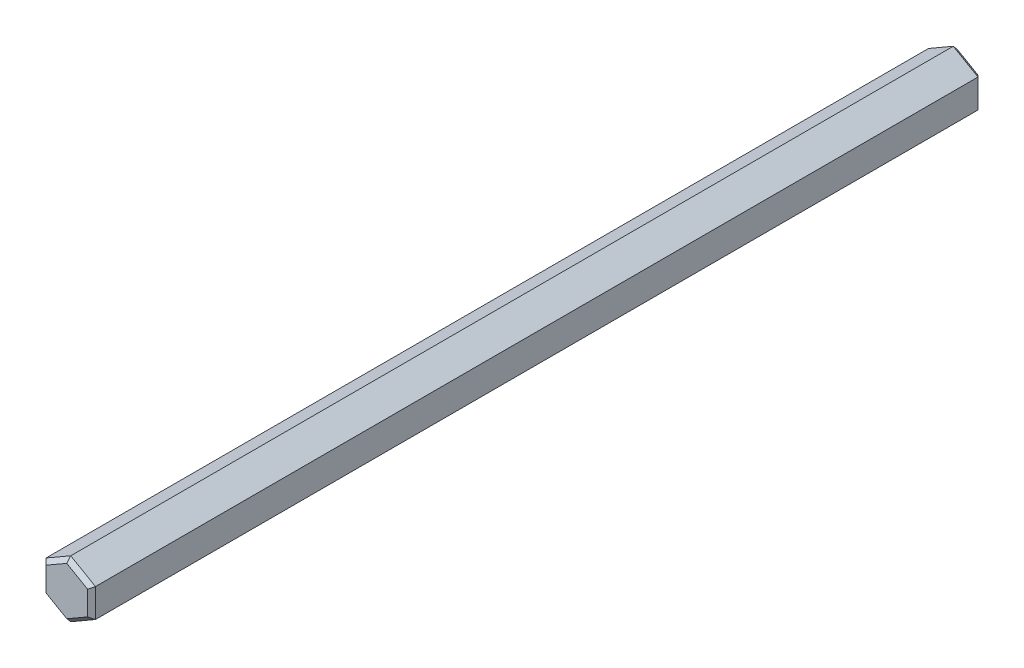
ISO-10303-21;
HEADER;
FILE_DESCRIPTION(('STEP AP214'),'2;1');
FILE_NAME('part.step','',(''),(''),'','','');
FILE_SCHEMA(('AUTOMOTIVE_DESIGN { 1 0 10303 214 1 1 1 1 }'));
ENDSEC;
DATA;
#1=APPLICATION_CONTEXT('core data for automotive mechanical design processes');
#2=APPLICATION_PROTOCOL_DEFINITION('international standard','automotive_design',2000,#1);
#3=PRODUCT_CONTEXT('',#1,'mechanical');
#4=PRODUCT('Part','Part','',(#3));
#5=PRODUCT_RELATED_PRODUCT_CATEGORY('part','',(#4));
#6=PRODUCT_DEFINITION_FORMATION('','',#4);
#7=PRODUCT_DEFINITION_CONTEXT('part definition',#1,'design');
#8=PRODUCT_DEFINITION('design','',#6,#7);
#9=PRODUCT_DEFINITION_SHAPE('','',#8);
#10=(LENGTH_UNIT() NAMED_UNIT(*) SI_UNIT(.MILLI.,.METRE.));
#11=(NAMED_UNIT(*) PLANE_ANGLE_UNIT() SI_UNIT($,.RADIAN.));
#12=(NAMED_UNIT(*) SI_UNIT($,.STERADIAN.) SOLID_ANGLE_UNIT());
#13=UNCERTAINTY_MEASURE_WITH_UNIT(LENGTH_MEASURE(1.E-05),#10,'distance_accuracy_value','');
#14=(GEOMETRIC_REPRESENTATION_CONTEXT(3) GLOBAL_UNCERTAINTY_ASSIGNED_CONTEXT((#13)) GLOBAL_UNIT_ASSIGNED_CONTEXT((#10,
#11,#12)) REPRESENTATION_CONTEXT('',''));
#15=CARTESIAN_POINT('',(0.,0.,0.));
#16=DIRECTION('',(0.,0.,1.));
#17=DIRECTION('',(1.,0.,0.));
#18=AXIS2_PLACEMENT_3D('',#15,#16,#17);
#19=CARTESIAN_POINT('',(2.5,-1.44337567297407,45.));
#20=DIRECTION('',(0.5,-0.866025403784439,0.));
#21=DIRECTION('',(0.866025403784439,0.5,0.));
#22=AXIS2_PLACEMENT_3D('',#19,#20,#21);
#23=PLANE('',#22);
#24=DIRECTION('',(0.,0.,-1.));
#25=VECTOR('',#24,1.);
#26=CARTESIAN_POINT('',(2.5,-1.44337567297407,45.));
#27=LINE('',#26,#25);
#28=CARTESIAN_POINT('',(2.5,-1.44337567297407,44.6));
#29=VERTEX_POINT('',#28);
#30=CARTESIAN_POINT('',(2.5,-1.44337567297407,-44.6));
#31=VERTEX_POINT('',#30);
#32=EDGE_CURVE('E150',#29,#31,#27,.T.);
#33=ORIENTED_EDGE('',*,*,#32,.F.);
#34=DIRECTION('',(-0.866025403784439,-0.5,0.));
#35=VECTOR('',#34,1.);
#36=CARTESIAN_POINT('',(0.,-2.88675134594813,44.6));
#37=LINE('',#36,#35);
#38=CARTESIAN_POINT('',(0.,-2.88675134594813,44.6));
#39=VERTEX_POINT('',#38);
#40=EDGE_CURVE('E182',#29,#39,#37,.T.);
#41=ORIENTED_EDGE('',*,*,#40,.T.);
#42=DIRECTION('',(0.,0.,-1.));
#43=VECTOR('',#42,1.);
#44=CARTESIAN_POINT('',(0.,-2.88675134594813,45.));
#45=LINE('',#44,#43);
#46=CARTESIAN_POINT('',(0.,-2.88675134594813,-44.6));
#47=VERTEX_POINT('',#46);
#48=EDGE_CURVE('E215',#39,#47,#45,.T.);
#49=ORIENTED_EDGE('',*,*,#48,.T.);
#50=DIRECTION('',(0.866025403784439,0.5,0.));
#51=VECTOR('',#50,1.);
#52=CARTESIAN_POINT('',(2.5,-1.44337567297407,-44.6));
#53=LINE('',#52,#51);
#54=EDGE_CURVE('E138',#47,#31,#53,.T.);
#55=ORIENTED_EDGE('',*,*,#54,.T.);
#56=EDGE_LOOP('',(#33,#41,#49,#55));
#57=FACE_BOUND('',#56,.T.);
#58=ADVANCED_FACE('F33',(#57),#23,.T.);
#59=CARTESIAN_POINT('',(2.5,1.44337567297406,45.));
#60=DIRECTION('',(1.,0.,0.));
#61=DIRECTION('',(0.,0.,-1.));
#62=AXIS2_PLACEMENT_3D('',#59,#60,#61);
#63=PLANE('',#62);
#64=DIRECTION('',(0.,0.,-1.));
#65=VECTOR('',#64,1.);
#66=CARTESIAN_POINT('',(2.5,1.44337567297406,45.));
#67=LINE('',#66,#65);
#68=CARTESIAN_POINT('',(2.5,1.44337567297406,44.6));
#69=VERTEX_POINT('',#68);
#70=CARTESIAN_POINT('',(2.5,1.44337567297406,-44.6));
#71=VERTEX_POINT('',#70);
#72=EDGE_CURVE('E131',#69,#71,#67,.T.);
#73=ORIENTED_EDGE('',*,*,#72,.F.);
#74=DIRECTION('',(0.,-1.,0.));
#75=VECTOR('',#74,1.);
#76=CARTESIAN_POINT('',(2.5,-1.44337567297407,44.6));
#77=LINE('',#76,#75);
#78=EDGE_CURVE('E146',#69,#29,#77,.T.);
#79=ORIENTED_EDGE('',*,*,#78,.T.);
#80=ORIENTED_EDGE('',*,*,#32,.T.);
#81=DIRECTION('',(0.,1.,0.));
#82=VECTOR('',#81,1.);
#83=CARTESIAN_POINT('',(2.5,1.44337567297406,-44.6));
#84=LINE('',#83,#82);
#85=EDGE_CURVE('E149',#31,#71,#84,.T.);
#86=ORIENTED_EDGE('',*,*,#85,.T.);
#87=EDGE_LOOP('',(#73,#79,#80,#86));
#88=FACE_BOUND('',#87,.T.);
#89=ADVANCED_FACE('F143',(#88),#63,.T.);
#90=CARTESIAN_POINT('',(0.,2.88675134594813,45.));
#91=DIRECTION('',(0.5,0.866025403784439,0.));
#92=DIRECTION('',(-0.866025403784439,0.5,0.));
#93=AXIS2_PLACEMENT_3D('',#90,#91,#92);
#94=PLANE('',#93);
#95=DIRECTION('',(0.,0.,-1.));
#96=VECTOR('',#95,1.);
#97=CARTESIAN_POINT('',(0.,2.88675134594813,45.));
#98=LINE('',#97,#96);
#99=CARTESIAN_POINT('',(0.,2.88675134594813,44.6));
#100=VERTEX_POINT('',#99);
#101=CARTESIAN_POINT('',(0.,2.88675134594813,-44.6));
#102=VERTEX_POINT('',#101);
#103=EDGE_CURVE('E133',#100,#102,#98,.T.);
#104=ORIENTED_EDGE('',*,*,#103,.F.);
#105=DIRECTION('',(0.866025403784439,-0.5,0.));
#106=VECTOR('',#105,1.);
#107=CARTESIAN_POINT('',(2.5,1.44337567297406,44.6));
#108=LINE('',#107,#106);
#109=EDGE_CURVE('E127',#100,#69,#108,.T.);
#110=ORIENTED_EDGE('',*,*,#109,.T.);
#111=ORIENTED_EDGE('',*,*,#72,.T.);
#112=DIRECTION('',(-0.866025403784439,0.5,0.));
#113=VECTOR('',#112,1.);
#114=CARTESIAN_POINT('',(0.,2.88675134594813,-44.6));
#115=LINE('',#114,#113);
#116=EDGE_CURVE('E139',#71,#102,#115,.T.);
#117=ORIENTED_EDGE('',*,*,#116,.T.);
#118=EDGE_LOOP('',(#104,#110,#111,#117));
#119=FACE_BOUND('',#118,.T.);
#120=ADVANCED_FACE('F129',(#119),#94,.T.);
#121=CARTESIAN_POINT('',(-2.5,1.44337567297407,45.));
#122=DIRECTION('',(-0.5,0.866025403784439,0.));
#123=DIRECTION('',(-0.866025403784439,-0.5,0.));
#124=AXIS2_PLACEMENT_3D('',#121,#122,#123);
#125=PLANE('',#124);
#126=DIRECTION('',(0.,0.,-1.));
#127=VECTOR('',#126,1.);
#128=CARTESIAN_POINT('',(-2.5,1.44337567297407,45.));
#129=LINE('',#128,#127);
#130=CARTESIAN_POINT('',(-2.5,1.44337567297407,44.6));
#131=VERTEX_POINT('',#130);
#132=CARTESIAN_POINT('',(-2.5,1.44337567297407,-44.6));
#133=VERTEX_POINT('',#132);
#134=EDGE_CURVE('E249',#131,#133,#129,.T.);
#135=ORIENTED_EDGE('',*,*,#134,.F.);
#136=DIRECTION('',(0.866025403784439,0.5,0.));
#137=VECTOR('',#136,1.);
#138=CARTESIAN_POINT('',(0.,2.88675134594813,44.6));
#139=LINE('',#138,#137);
#140=EDGE_CURVE('E186',#131,#100,#139,.T.);
#141=ORIENTED_EDGE('',*,*,#140,.T.);
#142=ORIENTED_EDGE('',*,*,#103,.T.);
#143=DIRECTION('',(-0.866025403784439,-0.5,0.));
#144=VECTOR('',#143,1.);
#145=CARTESIAN_POINT('',(-2.5,1.44337567297407,-44.6));
#146=LINE('',#145,#144);
#147=EDGE_CURVE('E184',#102,#133,#146,.T.);
#148=ORIENTED_EDGE('',*,*,#147,.T.);
#149=EDGE_LOOP('',(#135,#141,#142,#148));
#150=FACE_BOUND('',#149,.T.);
#151=ADVANCED_FACE('F266',(#150),#125,.T.);
#152=CARTESIAN_POINT('',(-2.5,-1.44337567297406,45.));
#153=DIRECTION('',(-1.,0.,0.));
#154=DIRECTION('',(0.,0.,1.));
#155=AXIS2_PLACEMENT_3D('',#152,#153,#154);
#156=PLANE('',#155);
#157=DIRECTION('',(0.,0.,-1.));
#158=VECTOR('',#157,1.);
#159=CARTESIAN_POINT('',(-2.5,-1.44337567297406,45.));
#160=LINE('',#159,#158);
#161=CARTESIAN_POINT('',(-2.5,-1.44337567297406,44.6));
#162=VERTEX_POINT('',#161);
#163=CARTESIAN_POINT('',(-2.5,-1.44337567297406,-44.6));
#164=VERTEX_POINT('',#163);
#165=EDGE_CURVE('E247',#162,#164,#160,.T.);
#166=ORIENTED_EDGE('',*,*,#165,.F.);
#167=DIRECTION('',(0.,1.,0.));
#168=VECTOR('',#167,1.);
#169=CARTESIAN_POINT('',(-2.5,1.44337567297407,44.6));
#170=LINE('',#169,#168);
#171=EDGE_CURVE('E194',#162,#131,#170,.T.);
#172=ORIENTED_EDGE('',*,*,#171,.T.);
#173=ORIENTED_EDGE('',*,*,#134,.T.);
#174=DIRECTION('',(0.,-1.,0.));
#175=VECTOR('',#174,1.);
#176=CARTESIAN_POINT('',(-2.5,-1.44337567297406,-44.6));
#177=LINE('',#176,#175);
#178=EDGE_CURVE('E192',#133,#164,#177,.T.);
#179=ORIENTED_EDGE('',*,*,#178,.T.);
#180=EDGE_LOOP('',(#166,#172,#173,#179));
#181=FACE_BOUND('',#180,.T.);
#182=ADVANCED_FACE('F303',(#181),#156,.T.);
#183=CARTESIAN_POINT('',(0.,-2.88675134594813,45.));
#184=DIRECTION('',(-0.5,-0.866025403784439,0.));
#185=DIRECTION('',(0.866025403784439,-0.5,0.));
#186=AXIS2_PLACEMENT_3D('',#183,#184,#185);
#187=PLANE('',#186);
#188=ORIENTED_EDGE('',*,*,#48,.F.);
#189=DIRECTION('',(-0.866025403784439,0.5,0.));
#190=VECTOR('',#189,1.);
#191=CARTESIAN_POINT('',(-2.5,-1.44337567297406,44.6));
#192=LINE('',#191,#190);
#193=EDGE_CURVE('E190',#39,#162,#192,.T.);
#194=ORIENTED_EDGE('',*,*,#193,.T.);
#195=ORIENTED_EDGE('',*,*,#165,.T.);
#196=DIRECTION('',(0.866025403784439,-0.5,0.));
#197=VECTOR('',#196,1.);
#198=CARTESIAN_POINT('',(0.,-2.88675134594813,-44.6));
#199=LINE('',#198,#197);
#200=EDGE_CURVE('E188',#164,#47,#199,.T.);
#201=ORIENTED_EDGE('',*,*,#200,.T.);
#202=EDGE_LOOP('',(#188,#194,#195,#201));
#203=FACE_BOUND('',#202,.T.);
#204=ADVANCED_FACE('F244',(#203),#187,.T.);
#205=CARTESIAN_POINT('',(0.,0.,45.));
#206=DIRECTION('',(0.,0.,-1.));
#207=DIRECTION('',(-1.,0.,0.));
#208=AXIS2_PLACEMENT_3D('',#205,#206,#207);
#209=PLANE('',#208);
#210=DIRECTION('',(0.866025403784439,0.5,0.));
#211=VECTOR('',#210,1.);
#212=CARTESIAN_POINT('',(2.30000000000001,-1.09696551146032,45.));
#213=LINE('',#212,#211);
#214=CARTESIAN_POINT('',(0.,-2.42487113059646,45.));
#215=VERTEX_POINT('',#214);
#216=CARTESIAN_POINT('',(2.10000000000003,-1.21243556529823,45.));
#217=VERTEX_POINT('',#216);
#218=EDGE_CURVE('E175',#215,#217,#213,.T.);
#219=ORIENTED_EDGE('',*,*,#218,.T.);
#220=DIRECTION('',(0.,1.,0.));
#221=VECTOR('',#220,1.);
#222=CARTESIAN_POINT('',(2.10000000000003,1.44337567297406,45.));
#223=LINE('',#222,#221);
#224=CARTESIAN_POINT('',(2.10000000000003,1.21243556529823,45.));
#225=VERTEX_POINT('',#224);
#226=EDGE_CURVE('E178',#217,#225,#223,.T.);
#227=ORIENTED_EDGE('',*,*,#226,.T.);
#228=DIRECTION('',(-0.866025403784439,0.5,0.));
#229=VECTOR('',#228,1.);
#230=CARTESIAN_POINT('',(-0.19999999999999,2.54034118443438,45.));
#231=LINE('',#230,#229);
#232=CARTESIAN_POINT('',(0.,2.42487113059646,45.));
#233=VERTEX_POINT('',#232);
#234=EDGE_CURVE('E155',#225,#233,#231,.T.);
#235=ORIENTED_EDGE('',*,*,#234,.T.);
#236=DIRECTION('',(-0.866025403784439,-0.5,0.));
#237=VECTOR('',#236,1.);
#238=CARTESIAN_POINT('',(-2.30000000000001,1.09696551146032,45.));
#239=LINE('',#238,#237);
#240=CARTESIAN_POINT('',(-2.10000000000003,1.21243556529823,45.));
#241=VERTEX_POINT('',#240);
#242=EDGE_CURVE('E173',#233,#241,#239,.T.);
#243=ORIENTED_EDGE('',*,*,#242,.T.);
#244=DIRECTION('',(0.,-1.,0.));
#245=VECTOR('',#244,1.);
#246=CARTESIAN_POINT('',(-2.10000000000003,-1.44337567297406,45.));
#247=LINE('',#246,#245);
#248=CARTESIAN_POINT('',(-2.10000000000003,-1.21243556529823,45.));
#249=VERTEX_POINT('',#248);
#250=EDGE_CURVE('E165',#241,#249,#247,.T.);
#251=ORIENTED_EDGE('',*,*,#250,.T.);
#252=DIRECTION('',(0.866025403784439,-0.5,0.));
#253=VECTOR('',#252,1.);
#254=CARTESIAN_POINT('',(0.19999999999999,-2.54034118443438,45.));
#255=LINE('',#254,#253);
#256=EDGE_CURVE('E167',#249,#215,#255,.T.);
#257=ORIENTED_EDGE('',*,*,#256,.T.);
#258=EDGE_LOOP('',(#219,#227,#235,#243,#251,#257));
#259=FACE_BOUND('',#258,.T.);
#260=ADVANCED_FACE('F274',(#259),#209,.F.);
#261=CARTESIAN_POINT('',(0.,0.,-45.));
#262=DIRECTION('',(0.,0.,-1.));
#263=DIRECTION('',(-1.,0.,0.));
#264=AXIS2_PLACEMENT_3D('',#261,#262,#263);
#265=PLANE('',#264);
#266=DIRECTION('',(0.866025403784439,0.5,0.));
#267=VECTOR('',#266,1.);
#268=CARTESIAN_POINT('',(-1.05000000000001,1.81865334794734,-45.));
#269=LINE('',#268,#267);
#270=CARTESIAN_POINT('',(-2.10000000000002,1.21243556529823,-45.));
#271=VERTEX_POINT('',#270);
#272=CARTESIAN_POINT('',(0.,2.42487113059645,-45.));
#273=VERTEX_POINT('',#272);
#274=EDGE_CURVE('E57',#271,#273,#269,.T.);
#275=ORIENTED_EDGE('',*,*,#274,.T.);
#276=DIRECTION('',(0.866025403784439,-0.5,0.));
#277=VECTOR('',#276,1.);
#278=CARTESIAN_POINT('',(1.05000000000001,1.81865334794734,-45.));
#279=LINE('',#278,#277);
#280=CARTESIAN_POINT('',(2.10000000000002,1.21243556529822,-45.));
#281=VERTEX_POINT('',#280);
#282=EDGE_CURVE('E11',#273,#281,#279,.T.);
#283=ORIENTED_EDGE('',*,*,#282,.T.);
#284=DIRECTION('',(0.,-1.,0.));
#285=VECTOR('',#284,1.);
#286=CARTESIAN_POINT('',(2.10000000000002,0.,-45.));
#287=LINE('',#286,#285);
#288=CARTESIAN_POINT('',(2.10000000000002,-1.21243556529823,-45.));
#289=VERTEX_POINT('',#288);
#290=EDGE_CURVE('E42',#281,#289,#287,.T.);
#291=ORIENTED_EDGE('',*,*,#290,.T.);
#292=DIRECTION('',(-0.866025403784439,-0.5,0.));
#293=VECTOR('',#292,1.);
#294=CARTESIAN_POINT('',(1.05000000000001,-1.81865334794734,-45.));
#295=LINE('',#294,#293);
#296=CARTESIAN_POINT('',(0.,-2.42487113059645,-45.));
#297=VERTEX_POINT('',#296);
#298=EDGE_CURVE('E200',#289,#297,#295,.T.);
#299=ORIENTED_EDGE('',*,*,#298,.T.);
#300=DIRECTION('',(-0.866025403784439,0.5,0.));
#301=VECTOR('',#300,1.);
#302=CARTESIAN_POINT('',(-1.05000000000001,-1.81865334794734,-45.));
#303=LINE('',#302,#301);
#304=CARTESIAN_POINT('',(-2.10000000000002,-1.21243556529822,-45.));
#305=VERTEX_POINT('',#304);
#306=EDGE_CURVE('E196',#297,#305,#303,.T.);
#307=ORIENTED_EDGE('',*,*,#306,.T.);
#308=DIRECTION('',(0.,1.,0.));
#309=VECTOR('',#308,1.);
#310=CARTESIAN_POINT('',(-2.10000000000002,0.,-45.));
#311=LINE('',#310,#309);
#312=EDGE_CURVE('E198',#305,#271,#311,.T.);
#313=ORIENTED_EDGE('',*,*,#312,.T.);
#314=EDGE_LOOP('',(#275,#283,#291,#299,#307,#313));
#315=FACE_BOUND('',#314,.T.);
#316=ADVANCED_FACE('F259',(#315),#265,.T.);
#317=CARTESIAN_POINT('',(-2.5,-1.44337567297406,44.6));
#318=DIRECTION('',(-0.70710678118656,0.,0.707106781186535));
#319=DIRECTION('',(0.,-1.,0.));
#320=AXIS2_PLACEMENT_3D('',#317,#318,#319);
#321=PLANE('',#320);
#322=DIRECTION('',(0.654653670707967,0.377964473009222,0.65465367070799));
#323=VECTOR('',#322,1.);
#324=CARTESIAN_POINT('',(-2.5,-1.44337567297406,44.6));
#325=LINE('',#324,#323);
#326=EDGE_CURVE('E209',#249,#162,#325,.F.);
#327=ORIENTED_EDGE('',*,*,#326,.F.);
#328=ORIENTED_EDGE('',*,*,#250,.F.);
#329=DIRECTION('',(-0.654653670707967,0.377964473009222,-0.65465367070799));
#330=VECTOR('',#329,1.);
#331=CARTESIAN_POINT('',(-1.78571428571431,1.03098262355292,45.3142857142857));
#332=LINE('',#331,#330);
#333=EDGE_CURVE('E212',#131,#241,#332,.F.);
#334=ORIENTED_EDGE('',*,*,#333,.F.);
#335=ORIENTED_EDGE('',*,*,#171,.F.);
#336=EDGE_LOOP('',(#327,#328,#334,#335));
#337=FACE_BOUND('',#336,.T.);
#338=ADVANCED_FACE('F277',(#337),#321,.T.);
#339=CARTESIAN_POINT('',(-2.5,1.44337567297407,44.6));
#340=DIRECTION('',(-0.35355339059328,0.612372435695805,0.707106781186535));
#341=DIRECTION('',(-0.866025403784439,-0.5,0.));
#342=AXIS2_PLACEMENT_3D('',#339,#340,#341);
#343=PLANE('',#342);
#344=ORIENTED_EDGE('',*,*,#333,.T.);
#345=ORIENTED_EDGE('',*,*,#242,.F.);
#346=DIRECTION('',(0.,0.755928946018443,-0.65465367070799));
#347=VECTOR('',#346,1.);
#348=CARTESIAN_POINT('',(0.,2.06196524710583,45.3142857142857));
#349=LINE('',#348,#347);
#350=EDGE_CURVE('E207',#100,#233,#349,.F.);
#351=ORIENTED_EDGE('',*,*,#350,.F.);
#352=ORIENTED_EDGE('',*,*,#140,.F.);
#353=EDGE_LOOP('',(#344,#345,#351,#352));
#354=FACE_BOUND('',#353,.T.);
#355=ADVANCED_FACE('F270',(#354),#343,.T.);
#356=CARTESIAN_POINT('',(0.,-2.88675134594813,44.6));
#357=DIRECTION('',(-0.35355339059328,-0.612372435695805,0.707106781186535));
#358=DIRECTION('',(0.866025403784439,-0.5,0.));
#359=AXIS2_PLACEMENT_3D('',#356,#357,#358);
#360=PLANE('',#359);
#361=ORIENTED_EDGE('',*,*,#326,.T.);
#362=ORIENTED_EDGE('',*,*,#193,.F.);
#363=DIRECTION('',(0.,0.755928946018443,0.65465367070799));
#364=VECTOR('',#363,1.);
#365=CARTESIAN_POINT('',(0.,-2.88675134594813,44.6));
#366=LINE('',#365,#364);
#367=EDGE_CURVE('E159',#215,#39,#366,.F.);
#368=ORIENTED_EDGE('',*,*,#367,.F.);
#369=ORIENTED_EDGE('',*,*,#256,.F.);
#370=EDGE_LOOP('',(#361,#362,#368,#369));
#371=FACE_BOUND('',#370,.T.);
#372=ADVANCED_FACE('F282',(#371),#360,.T.);
#373=CARTESIAN_POINT('',(0.,2.88675134594813,44.6));
#374=DIRECTION('',(0.35355339059328,0.612372435695805,0.707106781186535));
#375=DIRECTION('',(-0.866025403784439,0.5,0.));
#376=AXIS2_PLACEMENT_3D('',#373,#374,#375);
#377=PLANE('',#376);
#378=ORIENTED_EDGE('',*,*,#350,.T.);
#379=ORIENTED_EDGE('',*,*,#234,.F.);
#380=DIRECTION('',(0.654653670707968,0.377964473009221,-0.65465367070799));
#381=VECTOR('',#380,1.);
#382=CARTESIAN_POINT('',(1.7857142857143,1.03098262355291,45.3142857142857));
#383=LINE('',#382,#381);
#384=EDGE_CURVE('E153',#69,#225,#383,.F.);
#385=ORIENTED_EDGE('',*,*,#384,.F.);
#386=ORIENTED_EDGE('',*,*,#109,.F.);
#387=EDGE_LOOP('',(#378,#379,#385,#386));
#388=FACE_BOUND('',#387,.T.);
#389=ADVANCED_FACE('F154',(#388),#377,.T.);
#390=CARTESIAN_POINT('',(2.5,-1.44337567297407,44.6));
#391=DIRECTION('',(0.35355339059328,-0.612372435695806,0.707106781186535));
#392=DIRECTION('',(0.866025403784439,0.5,0.));
#393=AXIS2_PLACEMENT_3D('',#390,#391,#392);
#394=PLANE('',#393);
#395=ORIENTED_EDGE('',*,*,#367,.T.);
#396=ORIENTED_EDGE('',*,*,#40,.F.);
#397=DIRECTION('',(-0.654653670707968,0.377964473009221,0.65465367070799));
#398=VECTOR('',#397,1.);
#399=CARTESIAN_POINT('',(2.5,-1.44337567297407,44.6));
#400=LINE('',#399,#398);
#401=EDGE_CURVE('E160',#217,#29,#400,.F.);
#402=ORIENTED_EDGE('',*,*,#401,.F.);
#403=ORIENTED_EDGE('',*,*,#218,.F.);
#404=EDGE_LOOP('',(#395,#396,#402,#403));
#405=FACE_BOUND('',#404,.T.);
#406=ADVANCED_FACE('F285',(#405),#394,.T.);
#407=CARTESIAN_POINT('',(2.5,1.44337567297406,44.6));
#408=DIRECTION('',(0.70710678118656,0.,0.707106781186535));
#409=DIRECTION('',(0.,1.,0.));
#410=AXIS2_PLACEMENT_3D('',#407,#408,#409);
#411=PLANE('',#410);
#412=ORIENTED_EDGE('',*,*,#384,.T.);
#413=ORIENTED_EDGE('',*,*,#226,.F.);
#414=ORIENTED_EDGE('',*,*,#401,.T.);
#415=ORIENTED_EDGE('',*,*,#78,.F.);
#416=EDGE_LOOP('',(#412,#413,#414,#415));
#417=FACE_BOUND('',#416,.T.);
#418=ADVANCED_FACE('F162',(#417),#411,.T.);
#419=CARTESIAN_POINT('',(-1.05000000000001,-1.81865334794734,-45.));
#420=DIRECTION('',(0.353553390593276,0.612372435695799,0.707106781186542));
#421=DIRECTION('',(-0.866025403784439,0.5,0.));
#422=AXIS2_PLACEMENT_3D('',#419,#420,#421);
#423=PLANE('',#422);
#424=DIRECTION('',(0.,-0.75592894601845,0.654653670707982));
#425=VECTOR('',#424,1.);
#426=CARTESIAN_POINT('',(0.,-2.07846096908268,-45.3));
#427=LINE('',#426,#425);
#428=EDGE_CURVE('E224',#47,#297,#427,.F.);
#429=ORIENTED_EDGE('',*,*,#428,.F.);
#430=ORIENTED_EDGE('',*,*,#200,.F.);
#431=DIRECTION('',(0.654653670707973,0.377964473009225,-0.654653670707982));
#432=VECTOR('',#431,1.);
#433=CARTESIAN_POINT('',(-1.80000000000002,-1.03923048454133,-45.3));
#434=LINE('',#433,#432);
#435=EDGE_CURVE('E37',#305,#164,#434,.F.);
#436=ORIENTED_EDGE('',*,*,#435,.F.);
#437=ORIENTED_EDGE('',*,*,#306,.F.);
#438=EDGE_LOOP('',(#429,#430,#436,#437));
#439=FACE_BOUND('',#438,.T.);
#440=ADVANCED_FACE('F35',(#439),#423,.F.);
#441=CARTESIAN_POINT('',(-2.10000000000002,0.,-45.));
#442=DIRECTION('',(0.707106781186553,0.,0.707106781186543));
#443=DIRECTION('',(0.,1.,0.));
#444=AXIS2_PLACEMENT_3D('',#441,#442,#443);
#445=PLANE('',#444);
#446=ORIENTED_EDGE('',*,*,#435,.T.);
#447=ORIENTED_EDGE('',*,*,#178,.F.);
#448=DIRECTION('',(0.654653670707974,-0.377964473009224,-0.654653670707983));
#449=VECTOR('',#448,1.);
#450=CARTESIAN_POINT('',(-1.80000000000002,1.03923048454134,-45.3));
#451=LINE('',#450,#449);
#452=EDGE_CURVE('E222',#271,#133,#451,.F.);
#453=ORIENTED_EDGE('',*,*,#452,.F.);
#454=ORIENTED_EDGE('',*,*,#312,.F.);
#455=EDGE_LOOP('',(#446,#447,#453,#454));
#456=FACE_BOUND('',#455,.T.);
#457=ADVANCED_FACE('F235',(#456),#445,.F.);
#458=CARTESIAN_POINT('',(1.05000000000001,-1.81865334794734,-45.));
#459=DIRECTION('',(-0.353553390593276,0.612372435695799,0.707106781186543));
#460=DIRECTION('',(-0.866025403784439,-0.5,0.));
#461=AXIS2_PLACEMENT_3D('',#458,#459,#460);
#462=PLANE('',#461);
#463=ORIENTED_EDGE('',*,*,#428,.T.);
#464=ORIENTED_EDGE('',*,*,#298,.F.);
#465=DIRECTION('',(0.654653670707973,-0.377964473009225,0.654653670707982));
#466=VECTOR('',#465,1.);
#467=CARTESIAN_POINT('',(1.80000000000002,-1.03923048454134,-45.3));
#468=LINE('',#467,#466);
#469=EDGE_CURVE('E219',#31,#289,#468,.F.);
#470=ORIENTED_EDGE('',*,*,#469,.F.);
#471=ORIENTED_EDGE('',*,*,#54,.F.);
#472=EDGE_LOOP('',(#463,#464,#470,#471));
#473=FACE_BOUND('',#472,.T.);
#474=ADVANCED_FACE('F256',(#473),#462,.F.);
#475=CARTESIAN_POINT('',(-1.05000000000001,1.81865334794734,-45.));
#476=DIRECTION('',(0.353553390593276,-0.612372435695799,0.707106781186542));
#477=DIRECTION('',(0.866025403784439,0.5,0.));
#478=AXIS2_PLACEMENT_3D('',#475,#476,#477);
#479=PLANE('',#478);
#480=ORIENTED_EDGE('',*,*,#452,.T.);
#481=ORIENTED_EDGE('',*,*,#147,.F.);
#482=DIRECTION('',(0.,-0.75592894601845,-0.654653670707983));
#483=VECTOR('',#482,1.);
#484=CARTESIAN_POINT('',(0.,2.07846096908268,-45.3));
#485=LINE('',#484,#483);
#486=EDGE_CURVE('E217',#273,#102,#485,.F.);
#487=ORIENTED_EDGE('',*,*,#486,.F.);
#488=ORIENTED_EDGE('',*,*,#274,.F.);
#489=EDGE_LOOP('',(#480,#481,#487,#488));
#490=FACE_BOUND('',#489,.T.);
#491=ADVANCED_FACE('F263',(#490),#479,.F.);
#492=CARTESIAN_POINT('',(2.10000000000002,0.,-45.));
#493=DIRECTION('',(-0.707106781186553,0.,0.707106781186543));
#494=DIRECTION('',(0.,-1.,0.));
#495=AXIS2_PLACEMENT_3D('',#492,#493,#494);
#496=PLANE('',#495);
#497=ORIENTED_EDGE('',*,*,#469,.T.);
#498=ORIENTED_EDGE('',*,*,#290,.F.);
#499=DIRECTION('',(0.654653670707973,0.377964473009225,0.654653670707982));
#500=VECTOR('',#499,1.);
#501=CARTESIAN_POINT('',(1.80000000000002,1.03923048454134,-45.3));
#502=LINE('',#501,#500);
#503=EDGE_CURVE('E50',#71,#281,#502,.F.);
#504=ORIENTED_EDGE('',*,*,#503,.F.);
#505=ORIENTED_EDGE('',*,*,#85,.F.);
#506=EDGE_LOOP('',(#497,#498,#504,#505));
#507=FACE_BOUND('',#506,.T.);
#508=ADVANCED_FACE('F258',(#507),#496,.F.);
#509=CARTESIAN_POINT('',(1.05000000000001,1.81865334794734,-45.));
#510=DIRECTION('',(-0.353553390593276,-0.612372435695799,0.707106781186543));
#511=DIRECTION('',(0.866025403784439,-0.5,0.));
#512=AXIS2_PLACEMENT_3D('',#509,#510,#511);
#513=PLANE('',#512);
#514=ORIENTED_EDGE('',*,*,#486,.T.);
#515=ORIENTED_EDGE('',*,*,#116,.F.);
#516=ORIENTED_EDGE('',*,*,#503,.T.);
#517=ORIENTED_EDGE('',*,*,#282,.F.);
#518=EDGE_LOOP('',(#514,#515,#516,#517));
#519=FACE_BOUND('',#518,.T.);
#520=ADVANCED_FACE('F260',(#519),#513,.F.);
#521=CLOSED_SHELL('',(#58,#89,#120,#151,#182,#204,#260,#316,#338,#355,#372,#389,#406,#418,#440,
#457,#474,#491,#508,#520));
#522=MANIFOLD_SOLID_BREP('B2',#521);
#523=ADVANCED_BREP_SHAPE_REPRESENTATION('',(#18,#522),#14);
#524=SHAPE_DEFINITION_REPRESENTATION(#9,#523);
ENDSEC;
END-ISO-10303-21;
